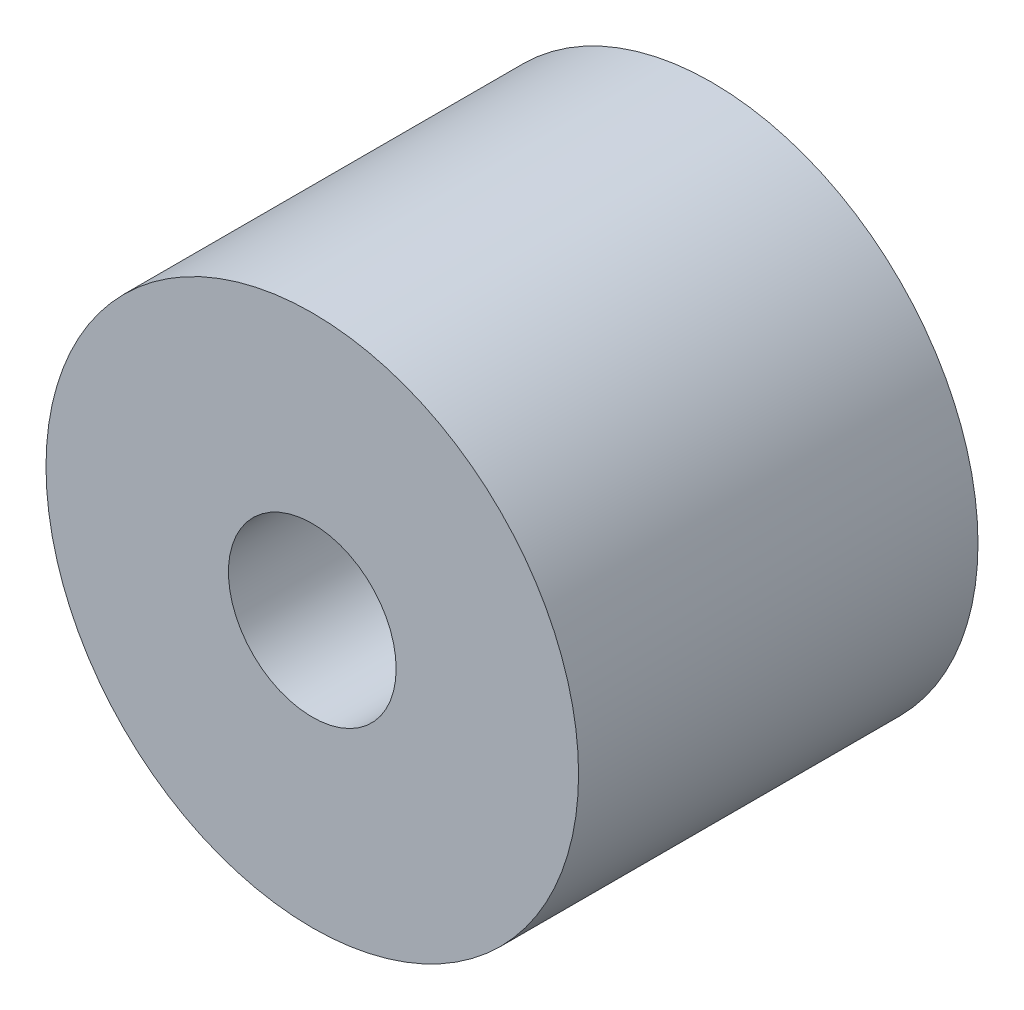
ISO-10303-21;
HEADER;
FILE_DESCRIPTION(('STEP AP214'),'2;1');
FILE_NAME('part.step','',(''),(''),'','','');
FILE_SCHEMA(('AUTOMOTIVE_DESIGN { 1 0 10303 214 1 1 1 1 }'));
ENDSEC;
DATA;
#1=APPLICATION_CONTEXT('core data for automotive mechanical design processes');
#2=APPLICATION_PROTOCOL_DEFINITION('international standard','automotive_design',2000,#1);
#3=PRODUCT_CONTEXT('',#1,'mechanical');
#4=PRODUCT('Part','Part','',(#3));
#5=PRODUCT_RELATED_PRODUCT_CATEGORY('part','',(#4));
#6=PRODUCT_DEFINITION_FORMATION('','',#4);
#7=PRODUCT_DEFINITION_CONTEXT('part definition',#1,'design');
#8=PRODUCT_DEFINITION('design','',#6,#7);
#9=PRODUCT_DEFINITION_SHAPE('','',#8);
#10=(LENGTH_UNIT() NAMED_UNIT(*) SI_UNIT(.MILLI.,.METRE.));
#11=(NAMED_UNIT(*) PLANE_ANGLE_UNIT() SI_UNIT($,.RADIAN.));
#12=(NAMED_UNIT(*) SI_UNIT($,.STERADIAN.) SOLID_ANGLE_UNIT());
#13=UNCERTAINTY_MEASURE_WITH_UNIT(LENGTH_MEASURE(1.E-05),#10,'distance_accuracy_value','');
#14=(GEOMETRIC_REPRESENTATION_CONTEXT(3) GLOBAL_UNCERTAINTY_ASSIGNED_CONTEXT((#13)) GLOBAL_UNIT_ASSIGNED_CONTEXT((#10,
#11,#12)) REPRESENTATION_CONTEXT('',''));
#15=CARTESIAN_POINT('',(0.,0.,0.));
#16=DIRECTION('',(0.,0.,1.));
#17=DIRECTION('',(1.,0.,0.));
#18=AXIS2_PLACEMENT_3D('',#15,#16,#17);
#19=CARTESIAN_POINT('',(0.,0.,9.52499999999998));
#20=DIRECTION('',(0.,0.,0.999999999999995));
#21=DIRECTION('',(1.,0.,0.));
#22=AXIS2_PLACEMENT_3D('',#19,#20,#21);
#23=PLANE('',#22);
#24=CARTESIAN_POINT('',(0.,0.,9.52499999999998));
#25=DIRECTION('',(0.,0.,0.999999999999995));
#26=DIRECTION('',(1.,0.,0.));
#27=AXIS2_PLACEMENT_3D('',#24,#25,#26);
#28=CIRCLE('',#27,6.35);
#29=CARTESIAN_POINT('',(-6.35,0.,9.52499999999998));
#30=VERTEX_POINT('',#29);
#31=EDGE_CURVE('E10',#30,#30,#28,.T.);
#32=ORIENTED_EDGE('',*,*,#31,.T.);
#33=EDGE_LOOP('',(#32));
#34=FACE_BOUND('',#33,.T.);
#35=CARTESIAN_POINT('',(0.,0.,9.52499999999998));
#36=DIRECTION('',(0.,0.,0.999999999999995));
#37=DIRECTION('',(1.,0.,0.));
#38=AXIS2_PLACEMENT_3D('',#35,#36,#37);
#39=CIRCLE('',#38,2.);
#40=CARTESIAN_POINT('',(2.00000000000001,0.,9.52499999999998));
#41=VERTEX_POINT('',#40);
#42=EDGE_CURVE('E45',#41,#41,#39,.T.);
#43=ORIENTED_EDGE('',*,*,#42,.F.);
#44=EDGE_LOOP('',(#43));
#45=FACE_BOUND('',#44,.T.);
#46=ADVANCED_FACE('F30',(#34,#45),#23,.T.);
#47=CARTESIAN_POINT('',(0.,0.,0.));
#48=DIRECTION('',(0.,0.,0.999999999999995));
#49=DIRECTION('',(1.,0.,0.));
#50=AXIS2_PLACEMENT_3D('',#47,#48,#49);
#51=PLANE('',#50);
#52=CARTESIAN_POINT('',(0.,0.,0.));
#53=DIRECTION('',(0.,0.,0.999999999999995));
#54=DIRECTION('',(1.,0.,0.));
#55=AXIS2_PLACEMENT_3D('',#52,#53,#54);
#56=CIRCLE('',#55,6.35);
#57=CARTESIAN_POINT('',(-6.35,0.,0.));
#58=VERTEX_POINT('',#57);
#59=EDGE_CURVE('E34',#58,#58,#56,.T.);
#60=ORIENTED_EDGE('',*,*,#59,.F.);
#61=EDGE_LOOP('',(#60));
#62=FACE_BOUND('',#61,.T.);
#63=CARTESIAN_POINT('',(0.,0.,0.));
#64=DIRECTION('',(0.,0.,0.999999999999995));
#65=DIRECTION('',(1.,0.,0.));
#66=AXIS2_PLACEMENT_3D('',#63,#64,#65);
#67=CIRCLE('',#66,2.);
#68=CARTESIAN_POINT('',(2.00000000000001,0.,0.));
#69=VERTEX_POINT('',#68);
#70=EDGE_CURVE('E41',#69,#69,#67,.F.);
#71=ORIENTED_EDGE('',*,*,#70,.F.);
#72=EDGE_LOOP('',(#71));
#73=FACE_BOUND('',#72,.T.);
#74=ADVANCED_FACE('F52',(#62,#73),#51,.F.);
#75=CARTESIAN_POINT('',(0.,0.,9.52499999999998));
#76=DIRECTION('',(0.,0.,-0.999999999999995));
#77=DIRECTION('',(-1.,0.,0.));
#78=AXIS2_PLACEMENT_3D('',#75,#76,#77);
#79=CYLINDRICAL_SURFACE('',#78,6.35);
#80=CARTESIAN_POINT('',(-6.35,0.,9.52499999999998));
#81=CARTESIAN_POINT('',(-6.35,0.,9.42578124999998));
#82=CARTESIAN_POINT('',(-6.35,0.,9.32656249999998));
#83=CARTESIAN_POINT('',(-6.35,0.,9.12812499999998));
#84=CARTESIAN_POINT('',(-6.35,0.,9.02890624999998));
#85=CARTESIAN_POINT('',(-6.35,0.,8.83046874999998));
#86=CARTESIAN_POINT('',(-6.35,0.,8.73124999999998));
#87=CARTESIAN_POINT('',(-6.35,0.,8.53281249999998));
#88=CARTESIAN_POINT('',(-6.35,0.,8.43359374999998));
#89=CARTESIAN_POINT('',(-6.35,0.,8.23515624999998));
#90=CARTESIAN_POINT('',(-6.35,0.,8.13593749999998));
#91=CARTESIAN_POINT('',(-6.35,0.,7.93749999999998));
#92=CARTESIAN_POINT('',(-6.35,0.,7.83828124999998));
#93=CARTESIAN_POINT('',(-6.35,0.,7.63984374999998));
#94=CARTESIAN_POINT('',(-6.35,0.,7.54062499999998));
#95=CARTESIAN_POINT('',(-6.35,0.,7.34218749999998));
#96=CARTESIAN_POINT('',(-6.35,0.,7.24296874999998));
#97=CARTESIAN_POINT('',(-6.35,0.,7.04453124999998));
#98=CARTESIAN_POINT('',(-6.35,0.,6.94531249999998));
#99=CARTESIAN_POINT('',(-6.35,0.,6.74687499999998));
#100=CARTESIAN_POINT('',(-6.35,0.,6.64765624999998));
#101=CARTESIAN_POINT('',(-6.35,0.,6.44921874999998));
#102=CARTESIAN_POINT('',(-6.35,0.,6.34999999999998));
#103=CARTESIAN_POINT('',(-6.35,0.,6.15156249999998));
#104=CARTESIAN_POINT('',(-6.35,0.,6.05234374999999));
#105=CARTESIAN_POINT('',(-6.35,0.,5.85390624999999));
#106=CARTESIAN_POINT('',(-6.35,0.,5.75468749999999));
#107=CARTESIAN_POINT('',(-6.35,0.,5.55624999999999));
#108=CARTESIAN_POINT('',(-6.35,0.,5.45703124999999));
#109=CARTESIAN_POINT('',(-6.35,0.,5.25859374999999));
#110=CARTESIAN_POINT('',(-6.35,0.,5.15937499999999));
#111=CARTESIAN_POINT('',(-6.35,0.,4.96093749999999));
#112=CARTESIAN_POINT('',(-6.35,0.,4.86171874999999));
#113=CARTESIAN_POINT('',(-6.35,0.,4.66328124999999));
#114=CARTESIAN_POINT('',(-6.35,0.,4.56406249999999));
#115=CARTESIAN_POINT('',(-6.35,0.,4.36562499999999));
#116=CARTESIAN_POINT('',(-6.35,0.,4.26640624999999));
#117=CARTESIAN_POINT('',(-6.35,0.,4.06796874999999));
#118=CARTESIAN_POINT('',(-6.35,0.,3.96874999999999));
#119=CARTESIAN_POINT('',(-6.35,0.,3.77031249999999));
#120=CARTESIAN_POINT('',(-6.35,0.,3.67109374999999));
#121=CARTESIAN_POINT('',(-6.35,0.,3.47265624999999));
#122=CARTESIAN_POINT('',(-6.35,0.,3.37343749999999));
#123=CARTESIAN_POINT('',(-6.35,0.,3.17499999999999));
#124=CARTESIAN_POINT('',(-6.35,0.,3.07578124999999));
#125=CARTESIAN_POINT('',(-6.35,0.,2.87734374999999));
#126=CARTESIAN_POINT('',(-6.35,0.,2.77812499999999));
#127=CARTESIAN_POINT('',(-6.35,0.,2.57968749999999));
#128=CARTESIAN_POINT('',(-6.35,0.,2.48046874999999));
#129=CARTESIAN_POINT('',(-6.35,0.,2.28203124999999));
#130=CARTESIAN_POINT('',(-6.35,0.,2.18281249999999));
#131=CARTESIAN_POINT('',(-6.35,0.,1.98437499999999));
#132=CARTESIAN_POINT('',(-6.35,0.,1.88515624999999));
#133=CARTESIAN_POINT('',(-6.35,0.,1.68671874999999));
#134=CARTESIAN_POINT('',(-6.35,0.,1.5875));
#135=CARTESIAN_POINT('',(-6.35,0.,1.3890625));
#136=CARTESIAN_POINT('',(-6.35,0.,1.28984375));
#137=CARTESIAN_POINT('',(-6.35,0.,1.09140625));
#138=CARTESIAN_POINT('',(-6.35,0.,0.992187499999997));
#139=CARTESIAN_POINT('',(-6.35,0.,0.793749999999997));
#140=CARTESIAN_POINT('',(-6.35,0.,0.694531249999997));
#141=CARTESIAN_POINT('',(-6.35,0.,0.496093749999997));
#142=CARTESIAN_POINT('',(-6.35,0.,0.396874999999997));
#143=CARTESIAN_POINT('',(-6.35,0.,0.198437499999997));
#144=CARTESIAN_POINT('',(-6.35,0.,0.0992187499999976));
#145=CARTESIAN_POINT('',(-6.35,0.,0.));
#146=B_SPLINE_CURVE_WITH_KNOTS('',3,(#80,#81,#82,#83,#84,#85,#86,#87,#88,#89,#90,#91,#92,#93,
#94,#95,#96,#97,#98,#99,#100,#101,#102,#103,#104,#105,#106,#107,#108,#109,#110,#111,#112,#113,
#114,#115,#116,#117,#118,#119,#120,#121,#122,#123,#124,#125,#126,#127,#128,#129,#130,#131,#132,
#133,#134,#135,#136,#137,#138,#139,#140,#141,#142,#143,#144,#145),.UNSPECIFIED.,.F.,.F.,(4,2,2,
2,2,2,2,2,2,2,2,2,2,2,2,2,2,2,2,2,2,2,2,2,2,2,2,2,2,2,2,2,4),(0.,0.29765625,0.5953125,
0.892968749999999,1.190625,1.48828125,1.7859375,2.08359375,2.38125,2.67890624999999,
2.97656249999999,3.27421874999999,3.57187499999999,3.86953124999999,4.16718749999999,
4.46484374999999,4.76249999999999,5.06015624999999,5.35781249999999,5.65546874999999,
5.95312499999999,6.25078124999999,6.54843749999999,6.84609374999999,7.14374999999999,
7.44140624999998,7.73906249999998,8.03671874999998,8.33437499999998,8.63203124999998,
8.92968749999998,9.22734374999998,9.52499999999998),.UNSPECIFIED.);
#147=EDGE_CURVE('BSEAM32',#30,#58,#146,.T.);
#148=ORIENTED_EDGE('',*,*,#31,.F.);
#149=ORIENTED_EDGE('',*,*,#59,.T.);
#150=ORIENTED_EDGE('',*,*,#147,.T.);
#151=ORIENTED_EDGE('',*,*,#147,.F.);
#152=EDGE_LOOP('',(#148,#150,#149,#151));
#153=FACE_BOUND('',#152,.T.);
#154=ADVANCED_FACE('F32',(#153),#79,.T.);
#155=CARTESIAN_POINT('',(0.,0.,-13.4703841816037));
#156=DIRECTION('',(0.,0.,0.999999999999995));
#157=DIRECTION('',(1.,0.,0.));
#158=AXIS2_PLACEMENT_3D('',#155,#156,#157);
#159=CYLINDRICAL_SURFACE('',#158,2.);
#160=CARTESIAN_POINT('',(2.00000000000001,0.,0.));
#161=CARTESIAN_POINT('',(2.00000000000001,0.,0.099218750000001));
#162=CARTESIAN_POINT('',(2.00000000000001,0.,0.198437500000001));
#163=CARTESIAN_POINT('',(2.00000000000001,0.,0.396875));
#164=CARTESIAN_POINT('',(2.00000000000001,0.,0.49609375));
#165=CARTESIAN_POINT('',(2.00000000000001,0.,0.69453125));
#166=CARTESIAN_POINT('',(2.00000000000001,0.,0.793749999999999));
#167=CARTESIAN_POINT('',(2.00000000000001,0.,0.992187499999999));
#168=CARTESIAN_POINT('',(2.00000000000001,0.,1.09140625));
#169=CARTESIAN_POINT('',(2.00000000000001,0.,1.28984375));
#170=CARTESIAN_POINT('',(2.00000000000001,0.,1.3890625));
#171=CARTESIAN_POINT('',(2.00000000000001,0.,1.5875));
#172=CARTESIAN_POINT('',(2.00000000000001,0.,1.68671875));
#173=CARTESIAN_POINT('',(2.00000000000001,0.,1.88515625));
#174=CARTESIAN_POINT('',(2.00000000000001,0.,1.984375));
#175=CARTESIAN_POINT('',(2.00000000000001,0.,2.1828125));
#176=CARTESIAN_POINT('',(2.00000000000001,0.,2.28203125));
#177=CARTESIAN_POINT('',(2.00000000000001,0.,2.48046875));
#178=CARTESIAN_POINT('',(2.00000000000001,0.,2.5796875));
#179=CARTESIAN_POINT('',(2.00000000000001,0.,2.77812499999999));
#180=CARTESIAN_POINT('',(2.00000000000001,0.,2.87734374999999));
#181=CARTESIAN_POINT('',(2.00000000000001,0.,3.07578124999999));
#182=CARTESIAN_POINT('',(2.00000000000001,0.,3.17499999999999));
#183=CARTESIAN_POINT('',(2.00000000000001,0.,3.37343749999999));
#184=CARTESIAN_POINT('',(2.00000000000001,0.,3.47265624999999));
#185=CARTESIAN_POINT('',(2.00000000000001,0.,3.67109374999999));
#186=CARTESIAN_POINT('',(2.00000000000001,0.,3.77031249999999));
#187=CARTESIAN_POINT('',(2.00000000000001,0.,3.96874999999999));
#188=CARTESIAN_POINT('',(2.00000000000001,0.,4.06796874999999));
#189=CARTESIAN_POINT('',(2.00000000000001,0.,4.26640624999999));
#190=CARTESIAN_POINT('',(2.00000000000001,0.,4.36562499999999));
#191=CARTESIAN_POINT('',(2.00000000000001,0.,4.56406249999999));
#192=CARTESIAN_POINT('',(2.00000000000001,0.,4.66328124999999));
#193=CARTESIAN_POINT('',(2.00000000000001,0.,4.86171874999999));
#194=CARTESIAN_POINT('',(2.00000000000001,0.,4.96093749999999));
#195=CARTESIAN_POINT('',(2.00000000000001,0.,5.15937499999999));
#196=CARTESIAN_POINT('',(2.00000000000001,0.,5.25859374999999));
#197=CARTESIAN_POINT('',(2.00000000000001,0.,5.45703124999999));
#198=CARTESIAN_POINT('',(2.00000000000001,0.,5.55624999999999));
#199=CARTESIAN_POINT('',(2.00000000000001,0.,5.75468749999999));
#200=CARTESIAN_POINT('',(2.00000000000001,0.,5.85390624999999));
#201=CARTESIAN_POINT('',(2.00000000000001,0.,6.05234374999999));
#202=CARTESIAN_POINT('',(2.00000000000001,0.,6.15156249999999));
#203=CARTESIAN_POINT('',(2.00000000000001,0.,6.34999999999999));
#204=CARTESIAN_POINT('',(2.00000000000001,0.,6.44921874999999));
#205=CARTESIAN_POINT('',(2.00000000000001,0.,6.64765624999999));
#206=CARTESIAN_POINT('',(2.00000000000001,0.,6.74687499999999));
#207=CARTESIAN_POINT('',(2.00000000000001,0.,6.94531249999999));
#208=CARTESIAN_POINT('',(2.00000000000001,0.,7.04453124999999));
#209=CARTESIAN_POINT('',(2.00000000000001,0.,7.24296874999998));
#210=CARTESIAN_POINT('',(2.00000000000001,0.,7.34218749999998));
#211=CARTESIAN_POINT('',(2.00000000000001,0.,7.54062499999998));
#212=CARTESIAN_POINT('',(2.00000000000001,0.,7.63984374999998));
#213=CARTESIAN_POINT('',(2.00000000000001,0.,7.83828124999998));
#214=CARTESIAN_POINT('',(2.00000000000001,0.,7.93749999999998));
#215=CARTESIAN_POINT('',(2.00000000000001,0.,8.13593749999998));
#216=CARTESIAN_POINT('',(2.00000000000001,0.,8.23515624999999));
#217=CARTESIAN_POINT('',(2.00000000000001,0.,8.43359374999998));
#218=CARTESIAN_POINT('',(2.00000000000001,0.,8.53281249999998));
#219=CARTESIAN_POINT('',(2.00000000000001,0.,8.73124999999998));
#220=CARTESIAN_POINT('',(2.00000000000001,0.,8.83046874999999));
#221=CARTESIAN_POINT('',(2.00000000000001,0.,9.02890624999998));
#222=CARTESIAN_POINT('',(2.00000000000001,0.,9.12812499999998));
#223=CARTESIAN_POINT('',(2.00000000000001,0.,9.32656249999998));
#224=CARTESIAN_POINT('',(2.00000000000001,0.,9.42578124999998));
#225=CARTESIAN_POINT('',(2.00000000000001,0.,9.52499999999998));
#226=B_SPLINE_CURVE_WITH_KNOTS('',3,(#160,#161,#162,#163,#164,#165,#166,#167,#168,#169,#170,
#171,#172,#173,#174,#175,#176,#177,#178,#179,#180,#181,#182,#183,#184,#185,#186,#187,#188,#189,
#190,#191,#192,#193,#194,#195,#196,#197,#198,#199,#200,#201,#202,#203,#204,#205,#206,#207,#208,
#209,#210,#211,#212,#213,#214,#215,#216,#217,#218,#219,#220,#221,#222,#223,#224,#225),
.UNSPECIFIED.,.F.,.F.,(4,2,2,2,2,2,2,2,2,2,2,2,2,2,2,2,2,2,2,2,2,2,2,2,2,2,2,2,2,2,2,2,4),(0.,
0.297656249999998,0.595312499999999,0.892968749999997,1.190625,1.48828125,1.7859375,
2.08359374999999,2.38125,2.67890624999999,2.97656249999999,3.27421874999999,3.57187499999999,
3.86953124999999,4.16718749999999,4.46484374999999,4.76249999999999,5.06015624999999,
5.35781249999999,5.65546874999999,5.95312499999999,6.25078124999999,6.54843749999999,
6.84609374999999,7.14374999999998,7.44140624999998,7.73906249999998,8.03671874999998,
8.33437499999998,8.63203124999998,8.92968749999998,9.22734374999998,9.52499999999998),.UNSPECIFIED.);
#227=EDGE_CURVE('BSEAM49',#69,#41,#226,.T.);
#228=ORIENTED_EDGE('',*,*,#70,.T.);
#229=ORIENTED_EDGE('',*,*,#42,.T.);
#230=ORIENTED_EDGE('',*,*,#227,.T.);
#231=ORIENTED_EDGE('',*,*,#227,.F.);
#232=EDGE_LOOP('',(#228,#230,#229,#231));
#233=FACE_BOUND('',#232,.T.);
#234=ADVANCED_FACE('F49',(#233),#159,.F.);
#235=CLOSED_SHELL('',(#46,#74,#154,#234));
#236=MANIFOLD_SOLID_BREP('B2',#235);
#237=ADVANCED_BREP_SHAPE_REPRESENTATION('',(#18,#236),#14);
#238=SHAPE_DEFINITION_REPRESENTATION(#9,#237);
ENDSEC;
END-ISO-10303-21;
